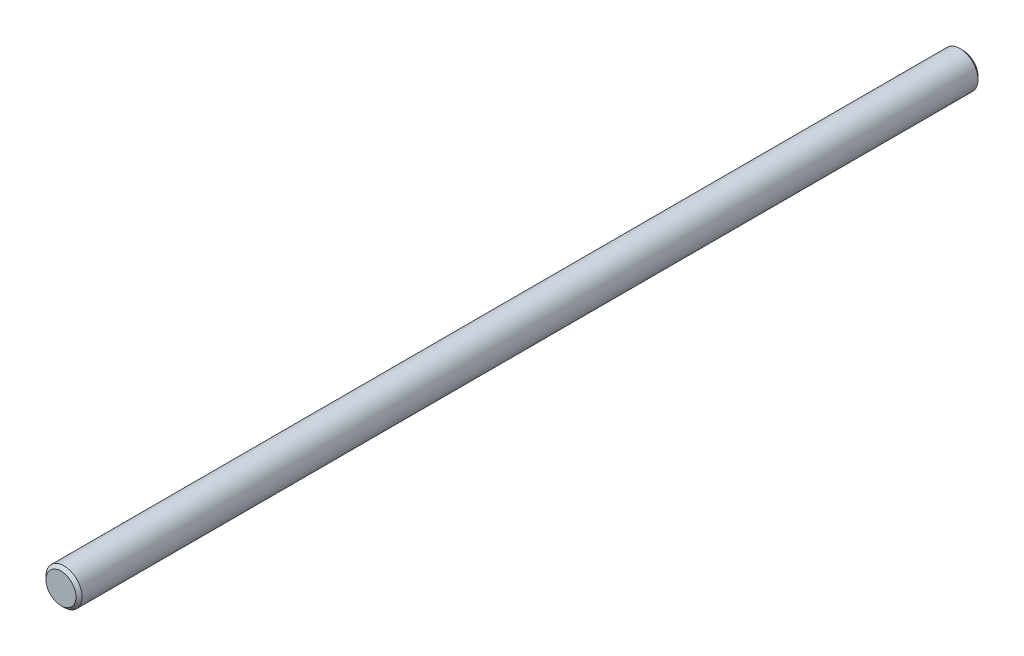
ISO-10303-21;
HEADER;
FILE_DESCRIPTION(('STEP AP214'),'2;1');
FILE_NAME('part.step','',(''),(''),'','','');
FILE_SCHEMA(('AUTOMOTIVE_DESIGN { 1 0 10303 214 1 1 1 1 }'));
ENDSEC;
DATA;
#1=APPLICATION_CONTEXT('core data for automotive mechanical design processes');
#2=APPLICATION_PROTOCOL_DEFINITION('international standard','automotive_design',2000,#1);
#3=PRODUCT_CONTEXT('',#1,'mechanical');
#4=PRODUCT('Part','Part','',(#3));
#5=PRODUCT_RELATED_PRODUCT_CATEGORY('part','',(#4));
#6=PRODUCT_DEFINITION_FORMATION('','',#4);
#7=PRODUCT_DEFINITION_CONTEXT('part definition',#1,'design');
#8=PRODUCT_DEFINITION('design','',#6,#7);
#9=PRODUCT_DEFINITION_SHAPE('','',#8);
#10=(LENGTH_UNIT() NAMED_UNIT(*) SI_UNIT(.MILLI.,.METRE.));
#11=(NAMED_UNIT(*) PLANE_ANGLE_UNIT() SI_UNIT($,.RADIAN.));
#12=(NAMED_UNIT(*) SI_UNIT($,.STERADIAN.) SOLID_ANGLE_UNIT());
#13=UNCERTAINTY_MEASURE_WITH_UNIT(LENGTH_MEASURE(1.E-05),#10,'distance_accuracy_value','');
#14=(GEOMETRIC_REPRESENTATION_CONTEXT(3) GLOBAL_UNCERTAINTY_ASSIGNED_CONTEXT((#13)) GLOBAL_UNIT_ASSIGNED_CONTEXT((#10,
#11,#12)) REPRESENTATION_CONTEXT('',''));
#15=CARTESIAN_POINT('',(0.,0.,0.));
#16=DIRECTION('',(0.,0.,1.));
#17=DIRECTION('',(1.,0.,0.));
#18=AXIS2_PLACEMENT_3D('',#15,#16,#17);
#19=CARTESIAN_POINT('',(0.,0.,150.));
#20=DIRECTION('',(0.,0.,-1.));
#21=DIRECTION('',(-1.,0.,0.));
#22=AXIS2_PLACEMENT_3D('',#19,#20,#21);
#23=CYLINDRICAL_SURFACE('',#22,6.);
#24=CARTESIAN_POINT('',(0.,0.,-149.));
#25=DIRECTION('',(0.,0.,1.));
#26=DIRECTION('',(1.,0.,0.));
#27=AXIS2_PLACEMENT_3D('',#24,#25,#26);
#28=CIRCLE('',#27,6.);
#29=CARTESIAN_POINT('',(6.,0.,-149.));
#30=VERTEX_POINT('',#29);
#31=EDGE_CURVE('E42',#30,#30,#28,.T.);
#32=ORIENTED_EDGE('',*,*,#31,.T.);
#33=EDGE_LOOP('',(#32));
#34=FACE_BOUND('',#33,.T.);
#35=CARTESIAN_POINT('',(0.,0.,149.));
#36=DIRECTION('',(0.,0.,1.));
#37=DIRECTION('',(1.,0.,0.));
#38=AXIS2_PLACEMENT_3D('',#35,#36,#37);
#39=CIRCLE('',#38,6.);
#40=CARTESIAN_POINT('',(6.,0.,149.));
#41=VERTEX_POINT('',#40);
#42=EDGE_CURVE('E46',#41,#41,#39,.F.);
#43=ORIENTED_EDGE('',*,*,#42,.T.);
#44=EDGE_LOOP('',(#43));
#45=FACE_BOUND('',#44,.T.);
#46=ADVANCED_FACE('F31',(#34,#45),#23,.T.);
#47=CARTESIAN_POINT('',(0.,0.,150.));
#48=DIRECTION('',(0.,0.,1.));
#49=DIRECTION('',(1.,0.,0.));
#50=AXIS2_PLACEMENT_3D('',#47,#48,#49);
#51=PLANE('',#50);
#52=CARTESIAN_POINT('',(0.,0.,150.));
#53=DIRECTION('',(0.,0.,1.));
#54=DIRECTION('',(1.,0.,0.));
#55=AXIS2_PLACEMENT_3D('',#52,#53,#54);
#56=CIRCLE('',#55,5.);
#57=CARTESIAN_POINT('',(5.,0.,150.));
#58=VERTEX_POINT('',#57);
#59=EDGE_CURVE('E10',#58,#58,#56,.T.);
#60=ORIENTED_EDGE('',*,*,#59,.T.);
#61=EDGE_LOOP('',(#60));
#62=FACE_BOUND('',#61,.T.);
#63=ADVANCED_FACE('F62',(#62),#51,.T.);
#64=CARTESIAN_POINT('',(0.,0.,-150.));
#65=DIRECTION('',(0.,0.,1.));
#66=DIRECTION('',(1.,0.,0.));
#67=AXIS2_PLACEMENT_3D('',#64,#65,#66);
#68=PLANE('',#67);
#69=CARTESIAN_POINT('',(0.,0.,-150.));
#70=DIRECTION('',(0.,0.,1.));
#71=DIRECTION('',(1.,0.,0.));
#72=AXIS2_PLACEMENT_3D('',#69,#70,#71);
#73=CIRCLE('',#72,5.00000000000003);
#74=CARTESIAN_POINT('',(5.00000000000003,0.,-150.));
#75=VERTEX_POINT('',#74);
#76=EDGE_CURVE('E38',#75,#75,#73,.F.);
#77=ORIENTED_EDGE('',*,*,#76,.T.);
#78=EDGE_LOOP('',(#77));
#79=FACE_BOUND('',#78,.T.);
#80=ADVANCED_FACE('F59',(#79),#68,.F.);
#81=CARTESIAN_POINT('',(0.,0.,-149.));
#82=DIRECTION('',(0.,0.,1.));
#83=DIRECTION('',(1.,0.,0.));
#84=AXIS2_PLACEMENT_3D('',#81,#82,#83);
#85=CONICAL_SURFACE('',#84,6.,0.78539816339746);
#86=ORIENTED_EDGE('',*,*,#76,.F.);
#87=EDGE_LOOP('',(#86));
#88=FACE_BOUND('',#87,.T.);
#89=ORIENTED_EDGE('',*,*,#31,.F.);
#90=EDGE_LOOP('',(#89));
#91=FACE_BOUND('',#90,.T.);
#92=ADVANCED_FACE('F55',(#88,#91),#85,.T.);
#93=CARTESIAN_POINT('',(0.,0.,150.));
#94=DIRECTION('',(0.,0.,-1.));
#95=DIRECTION('',(-1.,0.,0.));
#96=AXIS2_PLACEMENT_3D('',#93,#94,#95);
#97=CONICAL_SURFACE('',#96,5.,0.785398163397446);
#98=ORIENTED_EDGE('',*,*,#42,.F.);
#99=EDGE_LOOP('',(#98));
#100=FACE_BOUND('',#99,.T.);
#101=ORIENTED_EDGE('',*,*,#59,.F.);
#102=EDGE_LOOP('',(#101));
#103=FACE_BOUND('',#102,.T.);
#104=ADVANCED_FACE('F33',(#100,#103),#97,.T.);
#105=CLOSED_SHELL('',(#46,#63,#80,#92,#104));
#106=MANIFOLD_SOLID_BREP('B2',#105);
#107=ADVANCED_BREP_SHAPE_REPRESENTATION('',(#18,#106),#14);
#108=SHAPE_DEFINITION_REPRESENTATION(#9,#107);
ENDSEC;
END-ISO-10303-21;
